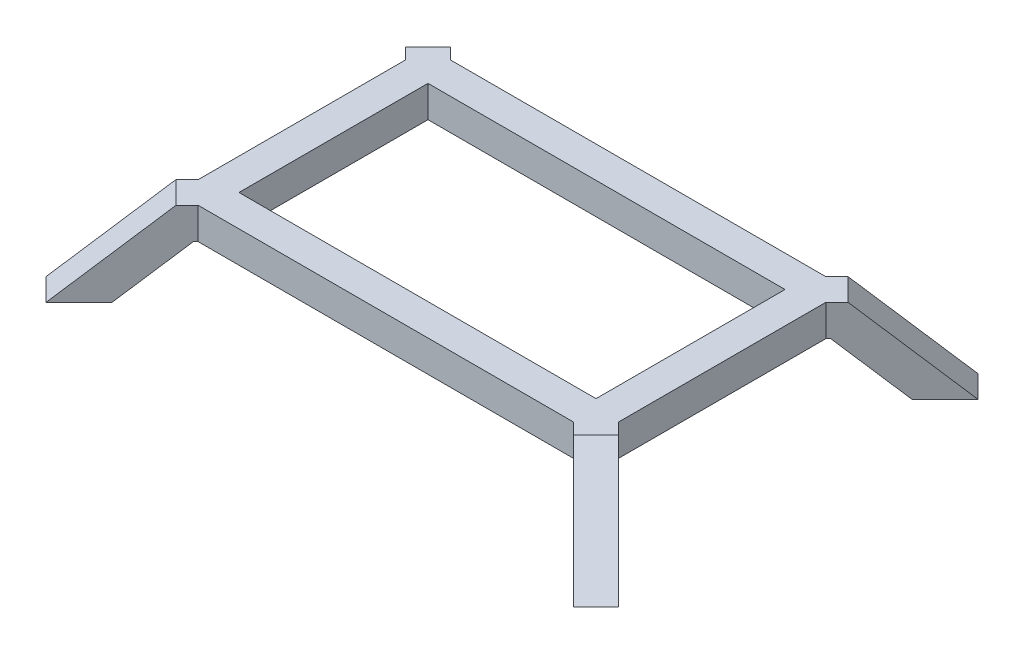
ISO-10303-21;
HEADER;
FILE_DESCRIPTION(('STEP AP214'),'2;1');
FILE_NAME('part.step','',(''),(''),'','','');
FILE_SCHEMA(('AUTOMOTIVE_DESIGN { 1 0 10303 214 1 1 1 1 }'));
ENDSEC;
DATA;
#1=APPLICATION_CONTEXT('core data for automotive mechanical design processes');
#2=APPLICATION_PROTOCOL_DEFINITION('international standard','automotive_design',2000,#1);
#3=PRODUCT_CONTEXT('',#1,'mechanical');
#4=PRODUCT('Part','Part','',(#3));
#5=PRODUCT_RELATED_PRODUCT_CATEGORY('part','',(#4));
#6=PRODUCT_DEFINITION_FORMATION('','',#4);
#7=PRODUCT_DEFINITION_CONTEXT('part definition',#1,'design');
#8=PRODUCT_DEFINITION('design','',#6,#7);
#9=PRODUCT_DEFINITION_SHAPE('','',#8);
#10=(LENGTH_UNIT() NAMED_UNIT(*) SI_UNIT(.MILLI.,.METRE.));
#11=(NAMED_UNIT(*) PLANE_ANGLE_UNIT() SI_UNIT($,.RADIAN.));
#12=(NAMED_UNIT(*) SI_UNIT($,.STERADIAN.) SOLID_ANGLE_UNIT());
#13=UNCERTAINTY_MEASURE_WITH_UNIT(LENGTH_MEASURE(1.E-05),#10,'distance_accuracy_value','');
#14=(GEOMETRIC_REPRESENTATION_CONTEXT(3) GLOBAL_UNCERTAINTY_ASSIGNED_CONTEXT((#13)) GLOBAL_UNIT_ASSIGNED_CONTEXT((#10,
#11,#12)) REPRESENTATION_CONTEXT('',''));
#15=CARTESIAN_POINT('',(0.,0.,0.));
#16=DIRECTION('',(0.,0.,1.));
#17=DIRECTION('',(1.,0.,0.));
#18=AXIS2_PLACEMENT_3D('',#15,#16,#17);
#19=CARTESIAN_POINT('',(-254.,38.1,-152.4));
#20=DIRECTION('',(0.,0.,1.));
#21=DIRECTION('',(1.,0.,0.));
#22=AXIS2_PLACEMENT_3D('',#19,#20,#21);
#23=PLANE('',#22);
#24=DIRECTION('',(0.,1.,0.));
#25=VECTOR('',#24,1.);
#26=CARTESIAN_POINT('',(227.059231636793,38.1,-152.4));
#27=LINE('',#26,#25);
#28=CARTESIAN_POINT('',(227.059231636793,0.,-152.4));
#29=VERTEX_POINT('',#28);
#30=CARTESIAN_POINT('',(227.059231636793,38.1,-152.4));
#31=VERTEX_POINT('',#30);
#32=EDGE_CURVE('E224',#29,#31,#27,.T.);
#33=ORIENTED_EDGE('',*,*,#32,.F.);
#34=DIRECTION('',(-1.,0.,0.));
#35=VECTOR('',#34,1.);
#36=CARTESIAN_POINT('',(-254.,0.,-152.4));
#37=LINE('',#36,#35);
#38=CARTESIAN_POINT('',(-227.059231636792,0.,-152.4));
#39=VERTEX_POINT('',#38);
#40=EDGE_CURVE('E399',#29,#39,#37,.T.);
#41=ORIENTED_EDGE('',*,*,#40,.T.);
#42=DIRECTION('',(0.,-1.,0.));
#43=VECTOR('',#42,1.);
#44=CARTESIAN_POINT('',(-227.059231636792,38.1,-152.4));
#45=LINE('',#44,#43);
#46=CARTESIAN_POINT('',(-227.059231636792,38.1,-152.4));
#47=VERTEX_POINT('',#46);
#48=EDGE_CURVE('E41',#47,#39,#45,.T.);
#49=ORIENTED_EDGE('',*,*,#48,.F.);
#50=DIRECTION('',(-1.,0.,0.));
#51=VECTOR('',#50,1.);
#52=CARTESIAN_POINT('',(-254.,38.1,-152.4));
#53=LINE('',#52,#51);
#54=EDGE_CURVE('E388',#31,#47,#53,.T.);
#55=ORIENTED_EDGE('',*,*,#54,.F.);
#56=EDGE_LOOP('',(#33,#41,#49,#55));
#57=FACE_BOUND('',#56,.T.);
#58=ADVANCED_FACE('F33',(#57),#23,.F.);
#59=CARTESIAN_POINT('',(0.,0.,0.));
#60=DIRECTION('',(0.,-1.,0.));
#61=DIRECTION('',(0.,0.,-1.));
#62=AXIS2_PLACEMENT_3D('',#59,#60,#61);
#63=PLANE('',#62);
#64=DIRECTION('',(0.,0.,1.));
#65=VECTOR('',#64,1.);
#66=CARTESIAN_POINT('',(-215.9,0.,114.3));
#67=LINE('',#66,#65);
#68=CARTESIAN_POINT('',(-215.9,0.,-114.3));
#69=VERTEX_POINT('',#68);
#70=CARTESIAN_POINT('',(-215.9,0.,114.3));
#71=VERTEX_POINT('',#70);
#72=EDGE_CURVE('E358',#69,#71,#67,.T.);
#73=ORIENTED_EDGE('',*,*,#72,.T.);
#74=DIRECTION('',(1.,0.,0.));
#75=VECTOR('',#74,1.);
#76=CARTESIAN_POINT('',(-215.9,0.,114.3));
#77=LINE('',#76,#75);
#78=CARTESIAN_POINT('',(215.9,0.,114.3));
#79=VERTEX_POINT('',#78);
#80=EDGE_CURVE('E354',#71,#79,#77,.T.);
#81=ORIENTED_EDGE('',*,*,#80,.T.);
#82=DIRECTION('',(0.,0.,-1.));
#83=VECTOR('',#82,1.);
#84=CARTESIAN_POINT('',(215.9,0.,114.3));
#85=LINE('',#84,#83);
#86=CARTESIAN_POINT('',(215.9,0.,-114.3));
#87=VERTEX_POINT('',#86);
#88=EDGE_CURVE('E368',#79,#87,#85,.T.);
#89=ORIENTED_EDGE('',*,*,#88,.T.);
#90=DIRECTION('',(-1.,0.,0.));
#91=VECTOR('',#90,1.);
#92=CARTESIAN_POINT('',(-215.9,0.,-114.3));
#93=LINE('',#92,#91);
#94=EDGE_CURVE('E371',#87,#69,#93,.T.);
#95=ORIENTED_EDGE('',*,*,#94,.T.);
#96=EDGE_LOOP('',(#73,#81,#89,#95));
#97=FACE_BOUND('',#96,.T.);
#98=ORIENTED_EDGE('',*,*,#40,.F.);
#99=DIRECTION('',(-0.707106781186548,0.,0.707106781186548));
#100=VECTOR('',#99,1.);
#101=CARTESIAN_POINT('',(230.069880928021,0.,-155.410649291228));
#102=LINE('',#101,#100);
#103=CARTESIAN_POINT('',(230.069880928021,0.,-155.410649291228));
#104=VERTEX_POINT('',#103);
#105=EDGE_CURVE('E502',#104,#29,#102,.T.);
#106=ORIENTED_EDGE('',*,*,#105,.F.);
#107=DIRECTION('',(0.707106781186548,0.,0.707106781186547));
#108=VECTOR('',#107,1.);
#109=CARTESIAN_POINT('',(230.069880928021,0.,-155.410649291228));
#110=LINE('',#109,#108);
#111=CARTESIAN_POINT('',(257.010649291228,0.,-128.469880928021));
#112=VERTEX_POINT('',#111);
#113=EDGE_CURVE('E493',#104,#112,#110,.T.);
#114=ORIENTED_EDGE('',*,*,#113,.T.);
#115=DIRECTION('',(-0.707106781186548,0.,0.707106781186548));
#116=VECTOR('',#115,1.);
#117=CARTESIAN_POINT('',(257.010649291228,0.,-128.469880928021));
#118=LINE('',#117,#116);
#119=CARTESIAN_POINT('',(254.,0.,-125.459231636793));
#120=VERTEX_POINT('',#119);
#121=EDGE_CURVE('E228',#112,#120,#118,.T.);
#122=ORIENTED_EDGE('',*,*,#121,.T.);
#123=DIRECTION('',(0.,0.,-1.));
#124=VECTOR('',#123,1.);
#125=CARTESIAN_POINT('',(254.,0.,152.4));
#126=LINE('',#125,#124);
#127=CARTESIAN_POINT('',(254.,0.,125.459231636793));
#128=VERTEX_POINT('',#127);
#129=EDGE_CURVE('E385',#128,#120,#126,.T.);
#130=ORIENTED_EDGE('',*,*,#129,.F.);
#131=DIRECTION('',(-0.707106781186548,0.,-0.707106781186548));
#132=VECTOR('',#131,1.);
#133=CARTESIAN_POINT('',(257.010649291228,0.,128.469880928021));
#134=LINE('',#133,#132);
#135=CARTESIAN_POINT('',(257.010649291228,0.,128.469880928021));
#136=VERTEX_POINT('',#135);
#137=EDGE_CURVE('E300',#136,#128,#134,.T.);
#138=ORIENTED_EDGE('',*,*,#137,.F.);
#139=DIRECTION('',(0.707106781186548,0.,-0.707106781186547));
#140=VECTOR('',#139,1.);
#141=CARTESIAN_POINT('',(230.069880928021,0.,155.410649291228));
#142=LINE('',#141,#140);
#143=CARTESIAN_POINT('',(230.069880928021,0.,155.410649291228));
#144=VERTEX_POINT('',#143);
#145=EDGE_CURVE('E315',#144,#136,#142,.T.);
#146=ORIENTED_EDGE('',*,*,#145,.F.);
#147=DIRECTION('',(-0.707106781186548,0.,-0.707106781186548));
#148=VECTOR('',#147,1.);
#149=CARTESIAN_POINT('',(230.069880928021,0.,155.410649291228));
#150=LINE('',#149,#148);
#151=CARTESIAN_POINT('',(227.059231636793,0.,152.4));
#152=VERTEX_POINT('',#151);
#153=EDGE_CURVE('E284',#144,#152,#150,.T.);
#154=ORIENTED_EDGE('',*,*,#153,.T.);
#155=DIRECTION('',(1.,0.,0.));
#156=VECTOR('',#155,1.);
#157=CARTESIAN_POINT('',(-254.,0.,152.4));
#158=LINE('',#157,#156);
#159=CARTESIAN_POINT('',(-227.059231636792,0.,152.4));
#160=VERTEX_POINT('',#159);
#161=EDGE_CURVE('E389',#160,#152,#158,.T.);
#162=ORIENTED_EDGE('',*,*,#161,.F.);
#163=DIRECTION('',(0.707106781186548,0.,-0.707106781186548));
#164=VECTOR('',#163,1.);
#165=CARTESIAN_POINT('',(-230.069880928021,0.,155.410649291228));
#166=LINE('',#165,#164);
#167=CARTESIAN_POINT('',(-230.069880928021,0.,155.410649291228));
#168=VERTEX_POINT('',#167);
#169=EDGE_CURVE('E330',#168,#160,#166,.T.);
#170=ORIENTED_EDGE('',*,*,#169,.F.);
#171=DIRECTION('',(-0.707106781186548,0.,-0.707106781186547));
#172=VECTOR('',#171,1.);
#173=CARTESIAN_POINT('',(-230.069880928021,0.,155.410649291228));
#174=LINE('',#173,#172);
#175=CARTESIAN_POINT('',(-257.010649291228,0.,128.469880928021));
#176=VERTEX_POINT('',#175);
#177=EDGE_CURVE('E333',#168,#176,#174,.T.);
#178=ORIENTED_EDGE('',*,*,#177,.T.);
#179=DIRECTION('',(0.707106781186548,0.,-0.707106781186548));
#180=VECTOR('',#179,1.);
#181=CARTESIAN_POINT('',(-257.010649291228,0.,128.469880928021));
#182=LINE('',#181,#180);
#183=CARTESIAN_POINT('',(-254.,0.,125.459231636793));
#184=VERTEX_POINT('',#183);
#185=EDGE_CURVE('E323',#176,#184,#182,.T.);
#186=ORIENTED_EDGE('',*,*,#185,.T.);
#187=DIRECTION('',(0.,0.,1.));
#188=VECTOR('',#187,1.);
#189=CARTESIAN_POINT('',(-254.,0.,152.4));
#190=LINE('',#189,#188);
#191=CARTESIAN_POINT('',(-254.,0.,-125.459231636792));
#192=VERTEX_POINT('',#191);
#193=EDGE_CURVE('E401',#192,#184,#190,.T.);
#194=ORIENTED_EDGE('',*,*,#193,.F.);
#195=DIRECTION('',(0.707106781186548,0.,0.707106781186548));
#196=VECTOR('',#195,1.);
#197=CARTESIAN_POINT('',(-257.010649291228,0.,-128.469880928021));
#198=LINE('',#197,#196);
#199=CARTESIAN_POINT('',(-257.010649291228,0.,-128.469880928021));
#200=VERTEX_POINT('',#199);
#201=EDGE_CURVE('E55',#200,#192,#198,.T.);
#202=ORIENTED_EDGE('',*,*,#201,.F.);
#203=DIRECTION('',(-0.707106781186548,0.,0.707106781186547));
#204=VECTOR('',#203,1.);
#205=CARTESIAN_POINT('',(-230.069880928021,0.,-155.410649291228));
#206=LINE('',#205,#204);
#207=CARTESIAN_POINT('',(-230.069880928021,0.,-155.410649291228));
#208=VERTEX_POINT('',#207);
#209=EDGE_CURVE('E279',#208,#200,#206,.T.);
#210=ORIENTED_EDGE('',*,*,#209,.F.);
#211=DIRECTION('',(0.707106781186548,0.,0.707106781186548));
#212=VECTOR('',#211,1.);
#213=CARTESIAN_POINT('',(-230.069880928021,0.,-155.410649291228));
#214=LINE('',#213,#212);
#215=EDGE_CURVE('E250',#208,#39,#214,.T.);
#216=ORIENTED_EDGE('',*,*,#215,.T.);
#217=EDGE_LOOP('',(#98,#106,#114,#122,#130,#138,#146,#154,#162,#170,#178,#186,#194,#202,#210,#216));
#218=FACE_BOUND('',#217,.T.);
#219=ADVANCED_FACE('F425',(#97,#218),#63,.T.);
#220=CARTESIAN_POINT('',(-254.,38.1,152.4));
#221=DIRECTION('',(0.,0.,-1.));
#222=DIRECTION('',(-1.,0.,0.));
#223=AXIS2_PLACEMENT_3D('',#220,#221,#222);
#224=PLANE('',#223);
#225=DIRECTION('',(0.,-1.,0.));
#226=VECTOR('',#225,1.);
#227=CARTESIAN_POINT('',(227.059231636793,38.1,152.4));
#228=LINE('',#227,#226);
#229=CARTESIAN_POINT('',(227.059231636793,38.1,152.4));
#230=VERTEX_POINT('',#229);
#231=EDGE_CURVE('E317',#230,#152,#228,.T.);
#232=ORIENTED_EDGE('',*,*,#231,.F.);
#233=DIRECTION('',(1.,0.,0.));
#234=VECTOR('',#233,1.);
#235=CARTESIAN_POINT('',(-254.,38.1,152.4));
#236=LINE('',#235,#234);
#237=CARTESIAN_POINT('',(-227.059231636792,38.1,152.4));
#238=VERTEX_POINT('',#237);
#239=EDGE_CURVE('E393',#238,#230,#236,.T.);
#240=ORIENTED_EDGE('',*,*,#239,.F.);
#241=DIRECTION('',(0.,1.,0.));
#242=VECTOR('',#241,1.);
#243=CARTESIAN_POINT('',(-227.059231636792,38.1,152.4));
#244=LINE('',#243,#242);
#245=EDGE_CURVE('E396',#160,#238,#244,.T.);
#246=ORIENTED_EDGE('',*,*,#245,.F.);
#247=ORIENTED_EDGE('',*,*,#161,.T.);
#248=EDGE_LOOP('',(#232,#240,#246,#247));
#249=FACE_BOUND('',#248,.T.);
#250=ADVANCED_FACE('F466',(#249),#224,.F.);
#251=CARTESIAN_POINT('',(0.,38.1,0.));
#252=DIRECTION('',(0.,-1.,0.));
#253=DIRECTION('',(0.,0.,-1.));
#254=AXIS2_PLACEMENT_3D('',#251,#252,#253);
#255=PLANE('',#254);
#256=DIRECTION('',(0.707106781186547,0.,-0.707106781186548));
#257=VECTOR('',#256,1.);
#258=CARTESIAN_POINT('',(267.470384181604,38.1,-138.929615818396));
#259=LINE('',#258,#257);
#260=CARTESIAN_POINT('',(254.,38.1,-125.459231636792));
#261=VERTEX_POINT('',#260);
#262=CARTESIAN_POINT('',(267.470384181604,38.1,-138.929615818396));
#263=VERTEX_POINT('',#262);
#264=EDGE_CURVE('E48',#261,#263,#259,.T.);
#265=ORIENTED_EDGE('',*,*,#264,.T.);
#266=DIRECTION('',(0.707106781186548,0.,0.707106781186547));
#267=VECTOR('',#266,1.);
#268=CARTESIAN_POINT('',(240.529615818396,38.1,-165.870384181604));
#269=LINE('',#268,#267);
#270=CARTESIAN_POINT('',(240.529615818396,38.1,-165.870384181604));
#271=VERTEX_POINT('',#270);
#272=EDGE_CURVE('E232',#271,#263,#269,.T.);
#273=ORIENTED_EDGE('',*,*,#272,.F.);
#274=DIRECTION('',(0.707106781186547,0.,-0.707106781186548));
#275=VECTOR('',#274,1.);
#276=CARTESIAN_POINT('',(240.529615818396,38.1,-165.870384181604));
#277=LINE('',#276,#275);
#278=EDGE_CURVE('E218',#31,#271,#277,.T.);
#279=ORIENTED_EDGE('',*,*,#278,.F.);
#280=ORIENTED_EDGE('',*,*,#54,.T.);
#281=DIRECTION('',(-0.707106781186547,0.,-0.707106781186548));
#282=VECTOR('',#281,1.);
#283=CARTESIAN_POINT('',(-240.529615818396,38.1,-165.870384181604));
#284=LINE('',#283,#282);
#285=CARTESIAN_POINT('',(-240.529615818396,38.1,-165.870384181604));
#286=VERTEX_POINT('',#285);
#287=EDGE_CURVE('E248',#47,#286,#284,.T.);
#288=ORIENTED_EDGE('',*,*,#287,.T.);
#289=DIRECTION('',(-0.707106781186548,0.,0.707106781186547));
#290=VECTOR('',#289,1.);
#291=CARTESIAN_POINT('',(-240.529615818396,38.1,-165.870384181604));
#292=LINE('',#291,#290);
#293=CARTESIAN_POINT('',(-267.470384181604,38.1,-138.929615818396));
#294=VERTEX_POINT('',#293);
#295=EDGE_CURVE('E263',#286,#294,#292,.T.);
#296=ORIENTED_EDGE('',*,*,#295,.T.);
#297=DIRECTION('',(-0.707106781186547,0.,-0.707106781186548));
#298=VECTOR('',#297,1.);
#299=CARTESIAN_POINT('',(-267.470384181604,38.1,-138.929615818396));
#300=LINE('',#299,#298);
#301=CARTESIAN_POINT('',(-254.,38.1,-125.459231636793));
#302=VERTEX_POINT('',#301);
#303=EDGE_CURVE('E242',#302,#294,#300,.T.);
#304=ORIENTED_EDGE('',*,*,#303,.F.);
#305=DIRECTION('',(0.,0.,1.));
#306=VECTOR('',#305,1.);
#307=CARTESIAN_POINT('',(-254.,38.1,152.4));
#308=LINE('',#307,#306);
#309=CARTESIAN_POINT('',(-254.,38.1,125.459231636793));
#310=VERTEX_POINT('',#309);
#311=EDGE_CURVE('E391',#302,#310,#308,.T.);
#312=ORIENTED_EDGE('',*,*,#311,.T.);
#313=DIRECTION('',(-0.707106781186547,0.,0.707106781186548));
#314=VECTOR('',#313,1.);
#315=CARTESIAN_POINT('',(-267.470384181604,38.1,138.929615818396));
#316=LINE('',#315,#314);
#317=CARTESIAN_POINT('',(-267.470384181604,38.1,138.929615818396));
#318=VERTEX_POINT('',#317);
#319=EDGE_CURVE('E319',#310,#318,#316,.T.);
#320=ORIENTED_EDGE('',*,*,#319,.T.);
#321=DIRECTION('',(-0.707106781186548,0.,-0.707106781186547));
#322=VECTOR('',#321,1.);
#323=CARTESIAN_POINT('',(-240.529615818396,38.1,165.870384181604));
#324=LINE('',#323,#322);
#325=CARTESIAN_POINT('',(-240.529615818396,38.1,165.870384181604));
#326=VERTEX_POINT('',#325);
#327=EDGE_CURVE('E352',#326,#318,#324,.T.);
#328=ORIENTED_EDGE('',*,*,#327,.F.);
#329=DIRECTION('',(-0.707106781186547,0.,0.707106781186548));
#330=VECTOR('',#329,1.);
#331=CARTESIAN_POINT('',(-240.529615818396,38.1,165.870384181604));
#332=LINE('',#331,#330);
#333=EDGE_CURVE('E320',#238,#326,#332,.T.);
#334=ORIENTED_EDGE('',*,*,#333,.F.);
#335=ORIENTED_EDGE('',*,*,#239,.T.);
#336=DIRECTION('',(0.707106781186547,0.,0.707106781186548));
#337=VECTOR('',#336,1.);
#338=CARTESIAN_POINT('',(240.529615818396,38.1,165.870384181604));
#339=LINE('',#338,#337);
#340=CARTESIAN_POINT('',(240.529615818396,38.1,165.870384181604));
#341=VERTEX_POINT('',#340);
#342=EDGE_CURVE('E282',#230,#341,#339,.T.);
#343=ORIENTED_EDGE('',*,*,#342,.T.);
#344=DIRECTION('',(0.707106781186548,0.,-0.707106781186547));
#345=VECTOR('',#344,1.);
#346=CARTESIAN_POINT('',(240.529615818396,38.1,165.870384181604));
#347=LINE('',#346,#345);
#348=CARTESIAN_POINT('',(267.470384181604,38.1,138.929615818396));
#349=VERTEX_POINT('',#348);
#350=EDGE_CURVE('E297',#341,#349,#347,.T.);
#351=ORIENTED_EDGE('',*,*,#350,.T.);
#352=DIRECTION('',(0.707106781186547,0.,0.707106781186548));
#353=VECTOR('',#352,1.);
#354=CARTESIAN_POINT('',(267.470384181604,38.1,138.929615818396));
#355=LINE('',#354,#353);
#356=CARTESIAN_POINT('',(254.,38.1,125.459231636793));
#357=VERTEX_POINT('',#356);
#358=EDGE_CURVE('E281',#357,#349,#355,.T.);
#359=ORIENTED_EDGE('',*,*,#358,.F.);
#360=DIRECTION('',(0.,0.,-1.));
#361=VECTOR('',#360,1.);
#362=CARTESIAN_POINT('',(254.,38.1,152.4));
#363=LINE('',#362,#361);
#364=EDGE_CURVE('E386',#357,#261,#363,.T.);
#365=ORIENTED_EDGE('',*,*,#364,.T.);
#366=EDGE_LOOP('',(#265,#273,#279,#280,#288,#296,#304,#312,#320,#328,#334,#335,#343,#351,#359,#365));
#367=FACE_BOUND('',#366,.T.);
#368=DIRECTION('',(1.,0.,0.));
#369=VECTOR('',#368,1.);
#370=CARTESIAN_POINT('',(-215.9,38.1,114.3));
#371=LINE('',#370,#369);
#372=CARTESIAN_POINT('',(-215.9,38.1,114.3));
#373=VERTEX_POINT('',#372);
#374=CARTESIAN_POINT('',(215.9,38.1,114.3));
#375=VERTEX_POINT('',#374);
#376=EDGE_CURVE('E355',#373,#375,#371,.T.);
#377=ORIENTED_EDGE('',*,*,#376,.F.);
#378=DIRECTION('',(0.,0.,1.));
#379=VECTOR('',#378,1.);
#380=CARTESIAN_POINT('',(-215.9,38.1,114.3));
#381=LINE('',#380,#379);
#382=CARTESIAN_POINT('',(-215.9,38.1,-114.3));
#383=VERTEX_POINT('',#382);
#384=EDGE_CURVE('E363',#383,#373,#381,.T.);
#385=ORIENTED_EDGE('',*,*,#384,.F.);
#386=DIRECTION('',(-1.,0.,0.));
#387=VECTOR('',#386,1.);
#388=CARTESIAN_POINT('',(-215.9,38.1,-114.3));
#389=LINE('',#388,#387);
#390=CARTESIAN_POINT('',(215.9,38.1,-114.3));
#391=VERTEX_POINT('',#390);
#392=EDGE_CURVE('E360',#391,#383,#389,.T.);
#393=ORIENTED_EDGE('',*,*,#392,.F.);
#394=DIRECTION('',(0.,0.,-1.));
#395=VECTOR('',#394,1.);
#396=CARTESIAN_POINT('',(215.9,38.1,114.3));
#397=LINE('',#396,#395);
#398=EDGE_CURVE('E357',#375,#391,#397,.T.);
#399=ORIENTED_EDGE('',*,*,#398,.F.);
#400=EDGE_LOOP('',(#377,#385,#393,#399));
#401=FACE_BOUND('',#400,.T.);
#402=ADVANCED_FACE('F238',(#367,#401),#255,.F.);
#403=CARTESIAN_POINT('',(254.,38.1,152.4));
#404=DIRECTION('',(-1.,0.,0.));
#405=DIRECTION('',(0.,0.,1.));
#406=AXIS2_PLACEMENT_3D('',#403,#404,#405);
#407=PLANE('',#406);
#408=ORIENTED_EDGE('',*,*,#129,.T.);
#409=DIRECTION('',(0.,1.,0.));
#410=VECTOR('',#409,1.);
#411=CARTESIAN_POINT('',(254.,38.1,-125.459231636793));
#412=LINE('',#411,#410);
#413=EDGE_CURVE('E11',#120,#261,#412,.T.);
#414=ORIENTED_EDGE('',*,*,#413,.T.);
#415=ORIENTED_EDGE('',*,*,#364,.F.);
#416=DIRECTION('',(0.,-1.,0.));
#417=VECTOR('',#416,1.);
#418=CARTESIAN_POINT('',(254.,38.1,125.459231636793));
#419=LINE('',#418,#417);
#420=EDGE_CURVE('E410',#357,#128,#419,.T.);
#421=ORIENTED_EDGE('',*,*,#420,.T.);
#422=EDGE_LOOP('',(#408,#414,#415,#421));
#423=FACE_BOUND('',#422,.T.);
#424=ADVANCED_FACE('F35',(#423),#407,.F.);
#425=CARTESIAN_POINT('',(-254.,38.1,152.4));
#426=DIRECTION('',(1.,0.,0.));
#427=DIRECTION('',(0.,0.,-1.));
#428=AXIS2_PLACEMENT_3D('',#425,#426,#427);
#429=PLANE('',#428);
#430=ORIENTED_EDGE('',*,*,#311,.F.);
#431=DIRECTION('',(0.,-1.,0.));
#432=VECTOR('',#431,1.);
#433=CARTESIAN_POINT('',(-254.,38.1,-125.459231636793));
#434=LINE('',#433,#432);
#435=EDGE_CURVE('E413',#302,#192,#434,.T.);
#436=ORIENTED_EDGE('',*,*,#435,.T.);
#437=ORIENTED_EDGE('',*,*,#193,.T.);
#438=DIRECTION('',(0.,1.,0.));
#439=VECTOR('',#438,1.);
#440=CARTESIAN_POINT('',(-254.,38.1,125.459231636793));
#441=LINE('',#440,#439);
#442=EDGE_CURVE('E407',#184,#310,#441,.T.);
#443=ORIENTED_EDGE('',*,*,#442,.T.);
#444=EDGE_LOOP('',(#430,#436,#437,#443));
#445=FACE_BOUND('',#444,.T.);
#446=ADVANCED_FACE('F443',(#445),#429,.F.);
#447=CARTESIAN_POINT('',(-215.9,38.1,114.3));
#448=DIRECTION('',(0.,0.,-1.));
#449=DIRECTION('',(-1.,0.,0.));
#450=AXIS2_PLACEMENT_3D('',#447,#448,#449);
#451=PLANE('',#450);
#452=ORIENTED_EDGE('',*,*,#80,.F.);
#453=DIRECTION('',(0.,-1.,0.));
#454=VECTOR('',#453,1.);
#455=CARTESIAN_POINT('',(-215.9,38.1,114.3));
#456=LINE('',#455,#454);
#457=EDGE_CURVE('E365',#373,#71,#456,.T.);
#458=ORIENTED_EDGE('',*,*,#457,.F.);
#459=ORIENTED_EDGE('',*,*,#376,.T.);
#460=DIRECTION('',(0.,-1.,0.));
#461=VECTOR('',#460,1.);
#462=CARTESIAN_POINT('',(215.9,38.1,114.3));
#463=LINE('',#462,#461);
#464=EDGE_CURVE('E382',#375,#79,#463,.T.);
#465=ORIENTED_EDGE('',*,*,#464,.T.);
#466=EDGE_LOOP('',(#452,#458,#459,#465));
#467=FACE_BOUND('',#466,.T.);
#468=ADVANCED_FACE('F536',(#467),#451,.T.);
#469=CARTESIAN_POINT('',(215.9,38.1,114.3));
#470=DIRECTION('',(-1.,0.,0.));
#471=DIRECTION('',(0.,0.,1.));
#472=AXIS2_PLACEMENT_3D('',#469,#470,#471);
#473=PLANE('',#472);
#474=ORIENTED_EDGE('',*,*,#88,.F.);
#475=ORIENTED_EDGE('',*,*,#464,.F.);
#476=ORIENTED_EDGE('',*,*,#398,.T.);
#477=DIRECTION('',(0.,-1.,0.));
#478=VECTOR('',#477,1.);
#479=CARTESIAN_POINT('',(215.9,38.1,-114.3));
#480=LINE('',#479,#478);
#481=EDGE_CURVE('E380',#391,#87,#480,.T.);
#482=ORIENTED_EDGE('',*,*,#481,.T.);
#483=EDGE_LOOP('',(#474,#475,#476,#482));
#484=FACE_BOUND('',#483,.T.);
#485=ADVANCED_FACE('F543',(#484),#473,.T.);
#486=CARTESIAN_POINT('',(-215.9,38.1,-114.3));
#487=DIRECTION('',(0.,0.,1.));
#488=DIRECTION('',(1.,0.,0.));
#489=AXIS2_PLACEMENT_3D('',#486,#487,#488);
#490=PLANE('',#489);
#491=ORIENTED_EDGE('',*,*,#94,.F.);
#492=ORIENTED_EDGE('',*,*,#481,.F.);
#493=ORIENTED_EDGE('',*,*,#392,.T.);
#494=DIRECTION('',(0.,-1.,0.));
#495=VECTOR('',#494,1.);
#496=CARTESIAN_POINT('',(-215.9,38.1,-114.3));
#497=LINE('',#496,#495);
#498=EDGE_CURVE('E378',#383,#69,#497,.T.);
#499=ORIENTED_EDGE('',*,*,#498,.T.);
#500=EDGE_LOOP('',(#491,#492,#493,#499));
#501=FACE_BOUND('',#500,.T.);
#502=ADVANCED_FACE('F547',(#501),#490,.T.);
#503=CARTESIAN_POINT('',(-215.9,38.1,114.3));
#504=DIRECTION('',(1.,0.,0.));
#505=DIRECTION('',(0.,0.,-1.));
#506=AXIS2_PLACEMENT_3D('',#503,#504,#505);
#507=PLANE('',#506);
#508=ORIENTED_EDGE('',*,*,#72,.F.);
#509=ORIENTED_EDGE('',*,*,#498,.F.);
#510=ORIENTED_EDGE('',*,*,#384,.T.);
#511=ORIENTED_EDGE('',*,*,#457,.T.);
#512=EDGE_LOOP('',(#508,#509,#510,#511));
#513=FACE_BOUND('',#512,.T.);
#514=ADVANCED_FACE('F551',(#513),#507,.T.);
#515=CARTESIAN_POINT('',(-64.270384181604,0.,-64.2703841816039));
#516=DIRECTION('',(-0.707106781186548,0.,-0.707106781186547));
#517=DIRECTION('',(-0.707106781186547,0.,0.707106781186548));
#518=AXIS2_PLACEMENT_3D('',#515,#516,#517);
#519=PLANE('',#518);
#520=ORIENTED_EDGE('',*,*,#442,.F.);
#521=ORIENTED_EDGE('',*,*,#185,.F.);
#522=DIRECTION('',(0.521855969905761,0.674783441814805,-0.521855969905761));
#523=VECTOR('',#522,1.);
#524=CARTESIAN_POINT('',(-306.11952190952,-63.5,177.578753546313));
#525=LINE('',#524,#523);
#526=CARTESIAN_POINT('',(-306.11952190952,-63.5,177.578753546313));
#527=VERTEX_POINT('',#526);
#528=EDGE_CURVE('E340',#527,#176,#525,.T.);
#529=ORIENTED_EDGE('',*,*,#528,.F.);
#530=DIRECTION('',(0.707106781186548,0.,-0.707106781186547));
#531=VECTOR('',#530,1.);
#532=CARTESIAN_POINT('',(-346.044580370871,-63.5,217.503812007663));
#533=LINE('',#532,#531);
#534=CARTESIAN_POINT('',(-346.044580370871,-63.5,217.503812007663));
#535=VERTEX_POINT('',#534);
#536=EDGE_CURVE('E338',#535,#527,#533,.T.);
#537=ORIENTED_EDGE('',*,*,#536,.F.);
#538=DIRECTION('',(-0.521855969905761,-0.674783441814805,0.521855969905761));
#539=VECTOR('',#538,1.);
#540=CARTESIAN_POINT('',(-267.470384181604,38.1,138.929615818396));
#541=LINE('',#540,#539);
#542=EDGE_CURVE('E336',#318,#535,#541,.T.);
#543=ORIENTED_EDGE('',*,*,#542,.F.);
#544=ORIENTED_EDGE('',*,*,#319,.F.);
#545=EDGE_LOOP('',(#520,#521,#529,#537,#543,#544));
#546=FACE_BOUND('',#545,.T.);
#547=ADVANCED_FACE('F449',(#546),#519,.T.);
#548=CARTESIAN_POINT('',(-37.3296158183965,0.,-37.3296158183964));
#549=DIRECTION('',(-0.707106781186548,0.,-0.707106781186547));
#550=DIRECTION('',(-0.707106781186547,0.,0.707106781186548));
#551=AXIS2_PLACEMENT_3D('',#548,#549,#550);
#552=PLANE('',#551);
#553=ORIENTED_EDGE('',*,*,#169,.T.);
#554=ORIENTED_EDGE('',*,*,#245,.T.);
#555=ORIENTED_EDGE('',*,*,#333,.T.);
#556=DIRECTION('',(-0.521855969905761,-0.674783441814805,0.521855969905761));
#557=VECTOR('',#556,1.);
#558=CARTESIAN_POINT('',(-240.529615818396,38.1,165.870384181604));
#559=LINE('',#558,#557);
#560=CARTESIAN_POINT('',(-319.103812007663,-63.5,244.444580370871));
#561=VERTEX_POINT('',#560);
#562=EDGE_CURVE('E322',#326,#561,#559,.T.);
#563=ORIENTED_EDGE('',*,*,#562,.T.);
#564=DIRECTION('',(0.707106781186548,0.,-0.707106781186547));
#565=VECTOR('',#564,1.);
#566=CARTESIAN_POINT('',(-319.103812007663,-63.5,244.444580370871));
#567=LINE('',#566,#565);
#568=CARTESIAN_POINT('',(-279.178753546313,-63.5,204.51952190952));
#569=VERTEX_POINT('',#568);
#570=EDGE_CURVE('E325',#561,#569,#567,.T.);
#571=ORIENTED_EDGE('',*,*,#570,.T.);
#572=DIRECTION('',(0.521855969905761,0.674783441814805,-0.521855969905761));
#573=VECTOR('',#572,1.);
#574=CARTESIAN_POINT('',(-279.178753546313,-63.5,204.51952190952));
#575=LINE('',#574,#573);
#576=EDGE_CURVE('E327',#569,#168,#575,.T.);
#577=ORIENTED_EDGE('',*,*,#576,.T.);
#578=EDGE_LOOP('',(#553,#554,#555,#563,#571,#577));
#579=FACE_BOUND('',#578,.T.);
#580=ADVANCED_FACE('F461',(#579),#552,.F.);
#581=CARTESIAN_POINT('',(-240.529615818396,38.1,165.870384181604));
#582=DIRECTION('',(0.477143947539647,-0.738015790246093,-0.477143947539647));
#583=DIRECTION('',(0.,0.542933875689564,-0.839775450122656));
#584=AXIS2_PLACEMENT_3D('',#581,#582,#583);
#585=PLANE('',#584);
#586=ORIENTED_EDGE('',*,*,#542,.T.);
#587=DIRECTION('',(-0.707106781186548,0.,-0.707106781186547));
#588=VECTOR('',#587,1.);
#589=CARTESIAN_POINT('',(-319.103812007663,-63.5,244.444580370871));
#590=LINE('',#589,#588);
#591=EDGE_CURVE('E349',#561,#535,#590,.T.);
#592=ORIENTED_EDGE('',*,*,#591,.F.);
#593=ORIENTED_EDGE('',*,*,#562,.F.);
#594=ORIENTED_EDGE('',*,*,#327,.T.);
#595=EDGE_LOOP('',(#586,#592,#593,#594));
#596=FACE_BOUND('',#595,.T.);
#597=ADVANCED_FACE('F457',(#596),#585,.F.);
#598=CARTESIAN_POINT('',(-319.103812007663,-63.5,244.444580370871));
#599=DIRECTION('',(0.,1.,0.));
#600=DIRECTION('',(0.,0.,1.));
#601=AXIS2_PLACEMENT_3D('',#598,#599,#600);
#602=PLANE('',#601);
#603=ORIENTED_EDGE('',*,*,#536,.T.);
#604=DIRECTION('',(-0.707106781186548,0.,-0.707106781186547));
#605=VECTOR('',#604,1.);
#606=CARTESIAN_POINT('',(-279.178753546313,-63.5,204.51952190952));
#607=LINE('',#606,#605);
#608=EDGE_CURVE('E346',#569,#527,#607,.T.);
#609=ORIENTED_EDGE('',*,*,#608,.F.);
#610=ORIENTED_EDGE('',*,*,#570,.F.);
#611=ORIENTED_EDGE('',*,*,#591,.T.);
#612=EDGE_LOOP('',(#603,#609,#610,#611));
#613=FACE_BOUND('',#612,.T.);
#614=ADVANCED_FACE('F558',(#613),#602,.F.);
#615=CARTESIAN_POINT('',(-279.178753546313,-63.5,204.51952190952));
#616=DIRECTION('',(-0.477143947539647,0.738015790246093,0.477143947539647));
#617=DIRECTION('',(0.,-0.542933875689564,0.839775450122656));
#618=AXIS2_PLACEMENT_3D('',#615,#616,#617);
#619=PLANE('',#618);
#620=ORIENTED_EDGE('',*,*,#528,.T.);
#621=ORIENTED_EDGE('',*,*,#177,.F.);
#622=ORIENTED_EDGE('',*,*,#576,.F.);
#623=ORIENTED_EDGE('',*,*,#608,.T.);
#624=EDGE_LOOP('',(#620,#621,#622,#623));
#625=FACE_BOUND('',#624,.T.);
#626=ADVANCED_FACE('F561',(#625),#619,.F.);
#627=CARTESIAN_POINT('',(37.3296158183965,0.,-37.3296158183964));
#628=DIRECTION('',(0.707106781186548,0.,-0.707106781186547));
#629=DIRECTION('',(0.707106781186547,0.,0.707106781186548));
#630=AXIS2_PLACEMENT_3D('',#627,#628,#629);
#631=PLANE('',#630);
#632=ORIENTED_EDGE('',*,*,#342,.F.);
#633=ORIENTED_EDGE('',*,*,#231,.T.);
#634=ORIENTED_EDGE('',*,*,#153,.F.);
#635=DIRECTION('',(-0.521855969905761,0.674783441814805,-0.521855969905761));
#636=VECTOR('',#635,1.);
#637=CARTESIAN_POINT('',(279.178753546313,-63.5,204.51952190952));
#638=LINE('',#637,#636);
#639=CARTESIAN_POINT('',(279.178753546313,-63.5,204.51952190952));
#640=VERTEX_POINT('',#639);
#641=EDGE_CURVE('E288',#640,#144,#638,.T.);
#642=ORIENTED_EDGE('',*,*,#641,.F.);
#643=DIRECTION('',(-0.707106781186548,0.,-0.707106781186547));
#644=VECTOR('',#643,1.);
#645=CARTESIAN_POINT('',(319.103812007663,-63.5,244.444580370871));
#646=LINE('',#645,#644);
#647=CARTESIAN_POINT('',(319.103812007663,-63.5,244.444580370871));
#648=VERTEX_POINT('',#647);
#649=EDGE_CURVE('E291',#648,#640,#646,.T.);
#650=ORIENTED_EDGE('',*,*,#649,.F.);
#651=DIRECTION('',(0.521855969905761,-0.674783441814805,0.521855969905761));
#652=VECTOR('',#651,1.);
#653=CARTESIAN_POINT('',(240.529615818396,38.1,165.870384181604));
#654=LINE('',#653,#652);
#655=EDGE_CURVE('E294',#341,#648,#654,.T.);
#656=ORIENTED_EDGE('',*,*,#655,.F.);
#657=EDGE_LOOP('',(#632,#633,#634,#642,#650,#656));
#658=FACE_BOUND('',#657,.T.);
#659=ADVANCED_FACE('F471',(#658),#631,.F.);
#660=CARTESIAN_POINT('',(64.270384181604,0.,-64.2703841816039));
#661=DIRECTION('',(0.707106781186548,0.,-0.707106781186547));
#662=DIRECTION('',(0.707106781186547,0.,0.707106781186548));
#663=AXIS2_PLACEMENT_3D('',#660,#661,#662);
#664=PLANE('',#663);
#665=ORIENTED_EDGE('',*,*,#420,.F.);
#666=ORIENTED_EDGE('',*,*,#358,.T.);
#667=DIRECTION('',(0.521855969905761,-0.674783441814805,0.521855969905761));
#668=VECTOR('',#667,1.);
#669=CARTESIAN_POINT('',(267.470384181604,38.1,138.929615818396));
#670=LINE('',#669,#668);
#671=CARTESIAN_POINT('',(346.044580370871,-63.5,217.503812007663));
#672=VERTEX_POINT('',#671);
#673=EDGE_CURVE('E285',#349,#672,#670,.T.);
#674=ORIENTED_EDGE('',*,*,#673,.T.);
#675=DIRECTION('',(-0.707106781186548,0.,-0.707106781186547));
#676=VECTOR('',#675,1.);
#677=CARTESIAN_POINT('',(346.044580370871,-63.5,217.503812007663));
#678=LINE('',#677,#676);
#679=CARTESIAN_POINT('',(306.11952190952,-63.5,177.578753546313));
#680=VERTEX_POINT('',#679);
#681=EDGE_CURVE('E305',#672,#680,#678,.T.);
#682=ORIENTED_EDGE('',*,*,#681,.T.);
#683=DIRECTION('',(-0.521855969905761,0.674783441814805,-0.521855969905761));
#684=VECTOR('',#683,1.);
#685=CARTESIAN_POINT('',(306.11952190952,-63.5,177.578753546313));
#686=LINE('',#685,#684);
#687=EDGE_CURVE('E302',#680,#136,#686,.T.);
#688=ORIENTED_EDGE('',*,*,#687,.T.);
#689=ORIENTED_EDGE('',*,*,#137,.T.);
#690=EDGE_LOOP('',(#665,#666,#674,#682,#688,#689));
#691=FACE_BOUND('',#690,.T.);
#692=ADVANCED_FACE('F487',(#691),#664,.T.);
#693=CARTESIAN_POINT('',(279.178753546313,-63.5,204.51952190952));
#694=DIRECTION('',(-0.477143947539647,-0.738015790246093,-0.477143947539647));
#695=DIRECTION('',(0.,0.542933875689564,-0.839775450122656));
#696=AXIS2_PLACEMENT_3D('',#693,#694,#695);
#697=PLANE('',#696);
#698=ORIENTED_EDGE('',*,*,#687,.F.);
#699=DIRECTION('',(0.707106781186548,0.,-0.707106781186547));
#700=VECTOR('',#699,1.);
#701=CARTESIAN_POINT('',(279.178753546313,-63.5,204.51952190952));
#702=LINE('',#701,#700);
#703=EDGE_CURVE('E313',#640,#680,#702,.T.);
#704=ORIENTED_EDGE('',*,*,#703,.F.);
#705=ORIENTED_EDGE('',*,*,#641,.T.);
#706=ORIENTED_EDGE('',*,*,#145,.T.);
#707=EDGE_LOOP('',(#698,#704,#705,#706));
#708=FACE_BOUND('',#707,.T.);
#709=ADVANCED_FACE('F475',(#708),#697,.T.);
#710=CARTESIAN_POINT('',(319.103812007663,-63.5,244.444580370871));
#711=DIRECTION('',(0.,-1.,0.));
#712=DIRECTION('',(0.,0.,-1.));
#713=AXIS2_PLACEMENT_3D('',#710,#711,#712);
#714=PLANE('',#713);
#715=ORIENTED_EDGE('',*,*,#681,.F.);
#716=DIRECTION('',(0.707106781186548,0.,-0.707106781186547));
#717=VECTOR('',#716,1.);
#718=CARTESIAN_POINT('',(319.103812007663,-63.5,244.444580370871));
#719=LINE('',#718,#717);
#720=EDGE_CURVE('E311',#648,#672,#719,.T.);
#721=ORIENTED_EDGE('',*,*,#720,.F.);
#722=ORIENTED_EDGE('',*,*,#649,.T.);
#723=ORIENTED_EDGE('',*,*,#703,.T.);
#724=EDGE_LOOP('',(#715,#721,#722,#723));
#725=FACE_BOUND('',#724,.T.);
#726=ADVANCED_FACE('F478',(#725),#714,.T.);
#727=CARTESIAN_POINT('',(240.529615818396,38.1,165.870384181604));
#728=DIRECTION('',(0.477143947539647,0.738015790246093,0.477143947539647));
#729=DIRECTION('',(0.,-0.542933875689564,0.839775450122656));
#730=AXIS2_PLACEMENT_3D('',#727,#728,#729);
#731=PLANE('',#730);
#732=ORIENTED_EDGE('',*,*,#673,.F.);
#733=ORIENTED_EDGE('',*,*,#350,.F.);
#734=ORIENTED_EDGE('',*,*,#655,.T.);
#735=ORIENTED_EDGE('',*,*,#720,.T.);
#736=EDGE_LOOP('',(#732,#733,#734,#735));
#737=FACE_BOUND('',#736,.T.);
#738=ADVANCED_FACE('F483',(#737),#731,.T.);
#739=CARTESIAN_POINT('',(-37.3296158183965,0.,37.3296158183964));
#740=DIRECTION('',(-0.707106781186548,0.,0.707106781186547));
#741=DIRECTION('',(-0.707106781186547,0.,-0.707106781186548));
#742=AXIS2_PLACEMENT_3D('',#739,#740,#741);
#743=PLANE('',#742);
#744=ORIENTED_EDGE('',*,*,#287,.F.);
#745=ORIENTED_EDGE('',*,*,#48,.T.);
#746=ORIENTED_EDGE('',*,*,#215,.F.);
#747=DIRECTION('',(0.521855969905761,0.674783441814805,0.521855969905761));
#748=VECTOR('',#747,1.);
#749=CARTESIAN_POINT('',(-279.178753546313,-63.5,-204.51952190952));
#750=LINE('',#749,#748);
#751=CARTESIAN_POINT('',(-279.178753546313,-63.5,-204.51952190952));
#752=VERTEX_POINT('',#751);
#753=EDGE_CURVE('E254',#752,#208,#750,.T.);
#754=ORIENTED_EDGE('',*,*,#753,.F.);
#755=DIRECTION('',(0.707106781186548,0.,0.707106781186547));
#756=VECTOR('',#755,1.);
#757=CARTESIAN_POINT('',(-319.103812007663,-63.5,-244.444580370871));
#758=LINE('',#757,#756);
#759=CARTESIAN_POINT('',(-319.103812007663,-63.5,-244.444580370871));
#760=VERTEX_POINT('',#759);
#761=EDGE_CURVE('E257',#760,#752,#758,.T.);
#762=ORIENTED_EDGE('',*,*,#761,.F.);
#763=DIRECTION('',(-0.521855969905761,-0.674783441814805,-0.521855969905761));
#764=VECTOR('',#763,1.);
#765=CARTESIAN_POINT('',(-240.529615818396,38.1,-165.870384181604));
#766=LINE('',#765,#764);
#767=EDGE_CURVE('E260',#286,#760,#766,.T.);
#768=ORIENTED_EDGE('',*,*,#767,.F.);
#769=EDGE_LOOP('',(#744,#745,#746,#754,#762,#768));
#770=FACE_BOUND('',#769,.T.);
#771=ADVANCED_FACE('F419',(#770),#743,.F.);
#772=CARTESIAN_POINT('',(-64.270384181604,0.,64.2703841816039));
#773=DIRECTION('',(-0.707106781186548,0.,0.707106781186547));
#774=DIRECTION('',(-0.707106781186547,0.,-0.707106781186548));
#775=AXIS2_PLACEMENT_3D('',#772,#773,#774);
#776=PLANE('',#775);
#777=ORIENTED_EDGE('',*,*,#435,.F.);
#778=ORIENTED_EDGE('',*,*,#303,.T.);
#779=DIRECTION('',(-0.521855969905761,-0.674783441814805,-0.521855969905761));
#780=VECTOR('',#779,1.);
#781=CARTESIAN_POINT('',(-267.470384181604,38.1,-138.929615818396));
#782=LINE('',#781,#780);
#783=CARTESIAN_POINT('',(-346.044580370871,-63.5,-217.503812007663));
#784=VERTEX_POINT('',#783);
#785=EDGE_CURVE('E251',#294,#784,#782,.T.);
#786=ORIENTED_EDGE('',*,*,#785,.T.);
#787=DIRECTION('',(0.707106781186548,0.,0.707106781186547));
#788=VECTOR('',#787,1.);
#789=CARTESIAN_POINT('',(-346.044580370871,-63.5,-217.503812007663));
#790=LINE('',#789,#788);
#791=CARTESIAN_POINT('',(-306.11952190952,-63.5,-177.578753546313));
#792=VERTEX_POINT('',#791);
#793=EDGE_CURVE('E269',#784,#792,#790,.T.);
#794=ORIENTED_EDGE('',*,*,#793,.T.);
#795=DIRECTION('',(0.521855969905761,0.674783441814805,0.521855969905761));
#796=VECTOR('',#795,1.);
#797=CARTESIAN_POINT('',(-306.11952190952,-63.5,-177.578753546313));
#798=LINE('',#797,#796);
#799=EDGE_CURVE('E267',#792,#200,#798,.T.);
#800=ORIENTED_EDGE('',*,*,#799,.T.);
#801=ORIENTED_EDGE('',*,*,#201,.T.);
#802=EDGE_LOOP('',(#777,#778,#786,#794,#800,#801));
#803=FACE_BOUND('',#802,.T.);
#804=ADVANCED_FACE('F441',(#803),#776,.T.);
#805=CARTESIAN_POINT('',(-279.178753546313,-63.5,-204.51952190952));
#806=DIRECTION('',(0.477143947539647,-0.738015790246093,0.477143947539647));
#807=DIRECTION('',(0.,-0.542933875689564,-0.839775450122656));
#808=AXIS2_PLACEMENT_3D('',#805,#806,#807);
#809=PLANE('',#808);
#810=ORIENTED_EDGE('',*,*,#799,.F.);
#811=DIRECTION('',(-0.707106781186548,0.,0.707106781186547));
#812=VECTOR('',#811,1.);
#813=CARTESIAN_POINT('',(-279.178753546313,-63.5,-204.51952190952));
#814=LINE('',#813,#812);
#815=EDGE_CURVE('E277',#752,#792,#814,.T.);
#816=ORIENTED_EDGE('',*,*,#815,.F.);
#817=ORIENTED_EDGE('',*,*,#753,.T.);
#818=ORIENTED_EDGE('',*,*,#209,.T.);
#819=EDGE_LOOP('',(#810,#816,#817,#818));
#820=FACE_BOUND('',#819,.T.);
#821=ADVANCED_FACE('F430',(#820),#809,.T.);
#822=CARTESIAN_POINT('',(-319.103812007663,-63.5,-244.444580370871));
#823=DIRECTION('',(0.,-1.,0.));
#824=DIRECTION('',(0.,0.,-1.));
#825=AXIS2_PLACEMENT_3D('',#822,#823,#824);
#826=PLANE('',#825);
#827=ORIENTED_EDGE('',*,*,#793,.F.);
#828=DIRECTION('',(-0.707106781186548,0.,0.707106781186547));
#829=VECTOR('',#828,1.);
#830=CARTESIAN_POINT('',(-319.103812007663,-63.5,-244.444580370871));
#831=LINE('',#830,#829);
#832=EDGE_CURVE('E275',#760,#784,#831,.T.);
#833=ORIENTED_EDGE('',*,*,#832,.F.);
#834=ORIENTED_EDGE('',*,*,#761,.T.);
#835=ORIENTED_EDGE('',*,*,#815,.T.);
#836=EDGE_LOOP('',(#827,#833,#834,#835));
#837=FACE_BOUND('',#836,.T.);
#838=ADVANCED_FACE('F434',(#837),#826,.T.);
#839=CARTESIAN_POINT('',(-240.529615818396,38.1,-165.870384181604));
#840=DIRECTION('',(-0.477143947539647,0.738015790246093,-0.477143947539647));
#841=DIRECTION('',(0.,0.542933875689564,0.839775450122656));
#842=AXIS2_PLACEMENT_3D('',#839,#840,#841);
#843=PLANE('',#842);
#844=ORIENTED_EDGE('',*,*,#785,.F.);
#845=ORIENTED_EDGE('',*,*,#295,.F.);
#846=ORIENTED_EDGE('',*,*,#767,.T.);
#847=ORIENTED_EDGE('',*,*,#832,.T.);
#848=EDGE_LOOP('',(#844,#845,#846,#847));
#849=FACE_BOUND('',#848,.T.);
#850=ADVANCED_FACE('F437',(#849),#843,.T.);
#851=CARTESIAN_POINT('',(37.3296158183965,0.,37.3296158183964));
#852=DIRECTION('',(0.707106781186548,0.,0.707106781186547));
#853=DIRECTION('',(0.707106781186547,0.,-0.707106781186548));
#854=AXIS2_PLACEMENT_3D('',#851,#852,#853);
#855=PLANE('',#854);
#856=ORIENTED_EDGE('',*,*,#105,.T.);
#857=ORIENTED_EDGE('',*,*,#32,.T.);
#858=ORIENTED_EDGE('',*,*,#278,.T.);
#859=DIRECTION('',(0.521855969905761,-0.674783441814805,-0.521855969905761));
#860=VECTOR('',#859,1.);
#861=CARTESIAN_POINT('',(240.529615818396,38.1,-165.870384181604));
#862=LINE('',#861,#860);
#863=CARTESIAN_POINT('',(319.103812007663,-63.5,-244.444580370871));
#864=VERTEX_POINT('',#863);
#865=EDGE_CURVE('E221',#271,#864,#862,.T.);
#866=ORIENTED_EDGE('',*,*,#865,.T.);
#867=DIRECTION('',(-0.707106781186548,0.,0.707106781186547));
#868=VECTOR('',#867,1.);
#869=CARTESIAN_POINT('',(319.103812007663,-63.5,-244.444580370871));
#870=LINE('',#869,#868);
#871=CARTESIAN_POINT('',(279.178753546313,-63.5,-204.51952190952));
#872=VERTEX_POINT('',#871);
#873=EDGE_CURVE('E236',#864,#872,#870,.T.);
#874=ORIENTED_EDGE('',*,*,#873,.T.);
#875=DIRECTION('',(-0.521855969905761,0.674783441814805,0.521855969905761));
#876=VECTOR('',#875,1.);
#877=CARTESIAN_POINT('',(279.178753546313,-63.5,-204.51952190952));
#878=LINE('',#877,#876);
#879=EDGE_CURVE('E508',#872,#104,#878,.T.);
#880=ORIENTED_EDGE('',*,*,#879,.T.);
#881=EDGE_LOOP('',(#856,#857,#858,#866,#874,#880));
#882=FACE_BOUND('',#881,.T.);
#883=ADVANCED_FACE('F220',(#882),#855,.F.);
#884=CARTESIAN_POINT('',(64.270384181604,0.,64.2703841816039));
#885=DIRECTION('',(0.707106781186548,0.,0.707106781186547));
#886=DIRECTION('',(0.707106781186547,0.,-0.707106781186548));
#887=AXIS2_PLACEMENT_3D('',#884,#885,#886);
#888=PLANE('',#887);
#889=ORIENTED_EDGE('',*,*,#413,.F.);
#890=ORIENTED_EDGE('',*,*,#121,.F.);
#891=DIRECTION('',(-0.521855969905761,0.674783441814805,0.521855969905761));
#892=VECTOR('',#891,1.);
#893=CARTESIAN_POINT('',(306.11952190952,-63.5,-177.578753546313));
#894=LINE('',#893,#892);
#895=CARTESIAN_POINT('',(306.11952190952,-63.5,-177.578753546313));
#896=VERTEX_POINT('',#895);
#897=EDGE_CURVE('E496',#896,#112,#894,.T.);
#898=ORIENTED_EDGE('',*,*,#897,.F.);
#899=DIRECTION('',(-0.707106781186548,0.,0.707106781186547));
#900=VECTOR('',#899,1.);
#901=CARTESIAN_POINT('',(346.044580370871,-63.5,-217.503812007663));
#902=LINE('',#901,#900);
#903=CARTESIAN_POINT('',(346.044580370871,-63.5,-217.503812007663));
#904=VERTEX_POINT('',#903);
#905=EDGE_CURVE('E498',#904,#896,#902,.T.);
#906=ORIENTED_EDGE('',*,*,#905,.F.);
#907=DIRECTION('',(0.521855969905761,-0.674783441814805,-0.521855969905761));
#908=VECTOR('',#907,1.);
#909=CARTESIAN_POINT('',(267.470384181604,38.1,-138.929615818396));
#910=LINE('',#909,#908);
#911=EDGE_CURVE('E512',#263,#904,#910,.T.);
#912=ORIENTED_EDGE('',*,*,#911,.F.);
#913=ORIENTED_EDGE('',*,*,#264,.F.);
#914=EDGE_LOOP('',(#889,#890,#898,#906,#912,#913));
#915=FACE_BOUND('',#914,.T.);
#916=ADVANCED_FACE('F511',(#915),#888,.T.);
#917=CARTESIAN_POINT('',(240.529615818396,38.1,-165.870384181604));
#918=DIRECTION('',(-0.477143947539647,-0.738015790246093,0.477143947539647));
#919=DIRECTION('',(0.,-0.542933875689564,-0.839775450122656));
#920=AXIS2_PLACEMENT_3D('',#917,#918,#919);
#921=PLANE('',#920);
#922=ORIENTED_EDGE('',*,*,#911,.T.);
#923=DIRECTION('',(0.707106781186548,0.,0.707106781186547));
#924=VECTOR('',#923,1.);
#925=CARTESIAN_POINT('',(319.103812007663,-63.5,-244.444580370871));
#926=LINE('',#925,#924);
#927=EDGE_CURVE('E234',#864,#904,#926,.T.);
#928=ORIENTED_EDGE('',*,*,#927,.F.);
#929=ORIENTED_EDGE('',*,*,#865,.F.);
#930=ORIENTED_EDGE('',*,*,#272,.T.);
#931=EDGE_LOOP('',(#922,#928,#929,#930));
#932=FACE_BOUND('',#931,.T.);
#933=ADVANCED_FACE('F231',(#932),#921,.F.);
#934=CARTESIAN_POINT('',(319.103812007663,-63.5,-244.444580370871));
#935=DIRECTION('',(0.,1.,0.));
#936=DIRECTION('',(0.,0.,1.));
#937=AXIS2_PLACEMENT_3D('',#934,#935,#936);
#938=PLANE('',#937);
#939=ORIENTED_EDGE('',*,*,#905,.T.);
#940=DIRECTION('',(0.707106781186548,0.,0.707106781186547));
#941=VECTOR('',#940,1.);
#942=CARTESIAN_POINT('',(279.178753546313,-63.5,-204.51952190952));
#943=LINE('',#942,#941);
#944=EDGE_CURVE('E244',#872,#896,#943,.T.);
#945=ORIENTED_EDGE('',*,*,#944,.F.);
#946=ORIENTED_EDGE('',*,*,#873,.F.);
#947=ORIENTED_EDGE('',*,*,#927,.T.);
#948=EDGE_LOOP('',(#939,#945,#946,#947));
#949=FACE_BOUND('',#948,.T.);
#950=ADVANCED_FACE('F518',(#949),#938,.F.);
#951=CARTESIAN_POINT('',(279.178753546313,-63.5,-204.51952190952));
#952=DIRECTION('',(0.477143947539647,0.738015790246093,-0.477143947539647));
#953=DIRECTION('',(0.,0.542933875689564,0.839775450122656));
#954=AXIS2_PLACEMENT_3D('',#951,#952,#953);
#955=PLANE('',#954);
#956=ORIENTED_EDGE('',*,*,#897,.T.);
#957=ORIENTED_EDGE('',*,*,#113,.F.);
#958=ORIENTED_EDGE('',*,*,#879,.F.);
#959=ORIENTED_EDGE('',*,*,#944,.T.);
#960=EDGE_LOOP('',(#956,#957,#958,#959));
#961=FACE_BOUND('',#960,.T.);
#962=ADVANCED_FACE('F507',(#961),#955,.F.);
#963=CLOSED_SHELL('',(#58,#219,#250,#402,#424,#446,#468,#485,#502,#514,#547,#580,#597,#614,#626,
#659,#692,#709,#726,#738,#771,#804,#821,#838,#850,#883,#916,#933,#950,#962));
#964=MANIFOLD_SOLID_BREP('B2',#963);
#965=ADVANCED_BREP_SHAPE_REPRESENTATION('',(#18,#964),#14);
#966=SHAPE_DEFINITION_REPRESENTATION(#9,#965);
ENDSEC;
END-ISO-10303-21;
